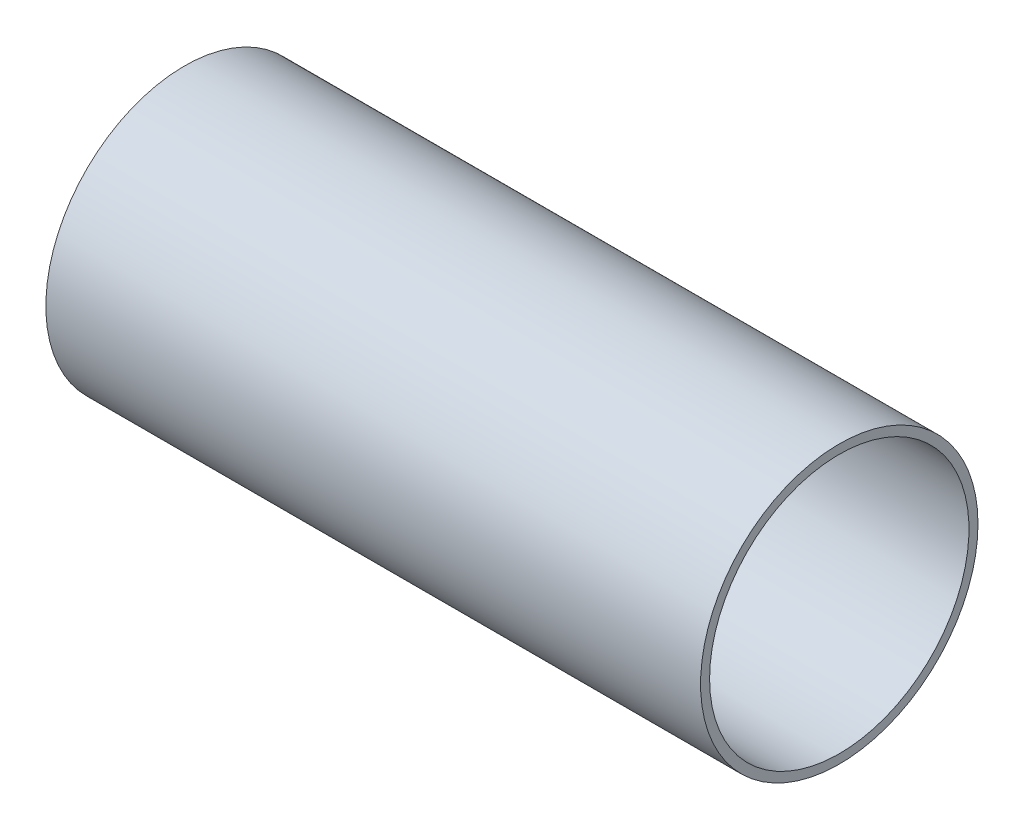
ISO-10303-21;
HEADER;
FILE_DESCRIPTION(('STEP AP214'),'2;1');
FILE_NAME('part.step','',(''),(''),'','','');
FILE_SCHEMA(('AUTOMOTIVE_DESIGN { 1 0 10303 214 1 1 1 1 }'));
ENDSEC;
DATA;
#1=APPLICATION_CONTEXT('core data for automotive mechanical design processes');
#2=APPLICATION_PROTOCOL_DEFINITION('international standard','automotive_design',2000,#1);
#3=PRODUCT_CONTEXT('',#1,'mechanical');
#4=PRODUCT('Part','Part','',(#3));
#5=PRODUCT_RELATED_PRODUCT_CATEGORY('part','',(#4));
#6=PRODUCT_DEFINITION_FORMATION('','',#4);
#7=PRODUCT_DEFINITION_CONTEXT('part definition',#1,'design');
#8=PRODUCT_DEFINITION('design','',#6,#7);
#9=PRODUCT_DEFINITION_SHAPE('','',#8);
#10=(LENGTH_UNIT() NAMED_UNIT(*) SI_UNIT(.MILLI.,.METRE.));
#11=(NAMED_UNIT(*) PLANE_ANGLE_UNIT() SI_UNIT($,.RADIAN.));
#12=(NAMED_UNIT(*) SI_UNIT($,.STERADIAN.) SOLID_ANGLE_UNIT());
#13=UNCERTAINTY_MEASURE_WITH_UNIT(LENGTH_MEASURE(1.E-05),#10,'distance_accuracy_value','');
#14=(GEOMETRIC_REPRESENTATION_CONTEXT(3) GLOBAL_UNCERTAINTY_ASSIGNED_CONTEXT((#13)) GLOBAL_UNIT_ASSIGNED_CONTEXT((#10,
#11,#12)) REPRESENTATION_CONTEXT('',''));
#15=CARTESIAN_POINT('',(0.,0.,0.));
#16=DIRECTION('',(0.,0.,1.));
#17=DIRECTION('',(1.,0.,0.));
#18=AXIS2_PLACEMENT_3D('',#15,#16,#17);
#19=CARTESIAN_POINT('',(27.73,0.,0.));
#20=DIRECTION('',(-1.,0.,0.));
#21=DIRECTION('',(0.,0.,1.));
#22=AXIS2_PLACEMENT_3D('',#19,#20,#21);
#23=PLANE('',#22);
#24=CARTESIAN_POINT('',(27.73,0.,0.));
#25=DIRECTION('',(-1.,0.,0.));
#26=DIRECTION('',(0.,0.,1.));
#27=AXIS2_PLACEMENT_3D('',#24,#25,#26);
#28=CIRCLE('',#27,4.675);
#29=CARTESIAN_POINT('',(27.73,0.,4.675));
#30=VERTEX_POINT('',#29);
#31=EDGE_CURVE('E34',#30,#30,#28,.F.);
#32=ORIENTED_EDGE('',*,*,#31,.T.);
#33=EDGE_LOOP('',(#32));
#34=FACE_BOUND('',#33,.T.);
#35=CARTESIAN_POINT('',(27.73,0.,0.));
#36=DIRECTION('',(1.,0.,0.));
#37=DIRECTION('',(0.,0.,-1.));
#38=AXIS2_PLACEMENT_3D('',#35,#36,#37);
#39=CIRCLE('',#38,2.);
#40=CARTESIAN_POINT('',(27.73,0.,-2.));
#41=VERTEX_POINT('',#40);
#42=EDGE_CURVE('E18',#41,#41,#39,.F.);
#43=ORIENTED_EDGE('',*,*,#42,.T.);
#44=EDGE_LOOP('',(#43));
#45=FACE_BOUND('',#44,.T.);
#46=ADVANCED_FACE('F15',(#34,#45),#23,.F.);
#47=CARTESIAN_POINT('',(32.33,0.,0.));
#48=DIRECTION('',(1.,0.,0.));
#49=DIRECTION('',(0.,0.,-1.));
#50=AXIS2_PLACEMENT_3D('',#47,#48,#49);
#51=CYLINDRICAL_SURFACE('',#50,2.);
#52=CARTESIAN_POINT('',(20.53,0.,0.));
#53=DIRECTION('',(1.,0.,0.));
#54=DIRECTION('',(0.,0.,-1.));
#55=AXIS2_PLACEMENT_3D('',#52,#53,#54);
#56=CIRCLE('',#55,2.);
#57=CARTESIAN_POINT('',(20.53,0.,-2.));
#58=VERTEX_POINT('',#57);
#59=EDGE_CURVE('E32',#58,#58,#56,.T.);
#60=ORIENTED_EDGE('',*,*,#59,.F.);
#61=EDGE_LOOP('',(#60));
#62=FACE_BOUND('',#61,.T.);
#63=ORIENTED_EDGE('',*,*,#42,.F.);
#64=EDGE_LOOP('',(#63));
#65=FACE_BOUND('',#64,.T.);
#66=ADVANCED_FACE('F42',(#62,#65),#51,.F.);
#67=CARTESIAN_POINT('',(35.93,0.,0.));
#68=DIRECTION('',(-1.,0.,0.));
#69=DIRECTION('',(0.,0.,1.));
#70=AXIS2_PLACEMENT_3D('',#67,#68,#69);
#71=CYLINDRICAL_SURFACE('',#70,4.675);
#72=CARTESIAN_POINT('',(44.13,0.,0.));
#73=DIRECTION('',(-1.,0.,0.));
#74=DIRECTION('',(0.,0.,1.));
#75=AXIS2_PLACEMENT_3D('',#72,#73,#74);
#76=CIRCLE('',#75,4.675);
#77=CARTESIAN_POINT('',(44.13,0.,4.675));
#78=VERTEX_POINT('',#77);
#79=EDGE_CURVE('E27',#78,#78,#76,.T.);
#80=ORIENTED_EDGE('',*,*,#79,.F.);
#81=EDGE_LOOP('',(#80));
#82=FACE_BOUND('',#81,.T.);
#83=ORIENTED_EDGE('',*,*,#31,.F.);
#84=EDGE_LOOP('',(#83));
#85=FACE_BOUND('',#84,.T.);
#86=ADVANCED_FACE('F44',(#82,#85),#71,.F.);
#87=CARTESIAN_POINT('',(20.53,0.,3.5));
#88=DIRECTION('',(-1.,0.,0.));
#89=DIRECTION('',(0.,0.,1.));
#90=AXIS2_PLACEMENT_3D('',#87,#88,#89);
#91=PLANE('',#90);
#92=ORIENTED_EDGE('',*,*,#59,.T.);
#93=EDGE_LOOP('',(#92));
#94=FACE_BOUND('',#93,.T.);
#95=CARTESIAN_POINT('',(20.53,0.,0.));
#96=DIRECTION('',(1.,0.,0.));
#97=DIRECTION('',(0.,0.,-1.));
#98=AXIS2_PLACEMENT_3D('',#95,#96,#97);
#99=CIRCLE('',#98,5.);
#100=CARTESIAN_POINT('',(20.53,0.,-5.));
#101=VERTEX_POINT('',#100);
#102=EDGE_CURVE('E22',#101,#101,#99,.T.);
#103=ORIENTED_EDGE('',*,*,#102,.F.);
#104=EDGE_LOOP('',(#103));
#105=FACE_BOUND('',#104,.T.);
#106=ADVANCED_FACE('F51',(#94,#105),#91,.T.);
#107=CARTESIAN_POINT('',(44.13,0.,3.5));
#108=DIRECTION('',(1.,0.,0.));
#109=DIRECTION('',(0.,0.,-1.));
#110=AXIS2_PLACEMENT_3D('',#107,#108,#109);
#111=PLANE('',#110);
#112=CARTESIAN_POINT('',(44.13,0.,0.));
#113=DIRECTION('',(1.,0.,0.));
#114=DIRECTION('',(0.,0.,-1.));
#115=AXIS2_PLACEMENT_3D('',#112,#113,#114);
#116=CIRCLE('',#115,5.);
#117=CARTESIAN_POINT('',(44.13,0.,-5.));
#118=VERTEX_POINT('',#117);
#119=EDGE_CURVE('E10',#118,#118,#116,.F.);
#120=ORIENTED_EDGE('',*,*,#119,.F.);
#121=EDGE_LOOP('',(#120));
#122=FACE_BOUND('',#121,.T.);
#123=ORIENTED_EDGE('',*,*,#79,.T.);
#124=EDGE_LOOP('',(#123));
#125=FACE_BOUND('',#124,.T.);
#126=ADVANCED_FACE('F57',(#122,#125),#111,.T.);
#127=CARTESIAN_POINT('',(32.33,0.,0.));
#128=DIRECTION('',(1.,0.,0.));
#129=DIRECTION('',(0.,0.,-1.));
#130=AXIS2_PLACEMENT_3D('',#127,#128,#129);
#131=CYLINDRICAL_SURFACE('',#130,5.);
#132=ORIENTED_EDGE('',*,*,#102,.T.);
#133=EDGE_LOOP('',(#132));
#134=FACE_BOUND('',#133,.T.);
#135=ORIENTED_EDGE('',*,*,#119,.T.);
#136=EDGE_LOOP('',(#135));
#137=FACE_BOUND('',#136,.T.);
#138=ADVANCED_FACE('F55',(#134,#137),#131,.T.);
#139=CLOSED_SHELL('',(#46,#66,#86,#106,#126,#138));
#140=MANIFOLD_SOLID_BREP('B1',#139);
#141=ADVANCED_BREP_SHAPE_REPRESENTATION('',(#18,#140),#14);
#142=SHAPE_DEFINITION_REPRESENTATION(#9,#141);
ENDSEC;
END-ISO-10303-21;
